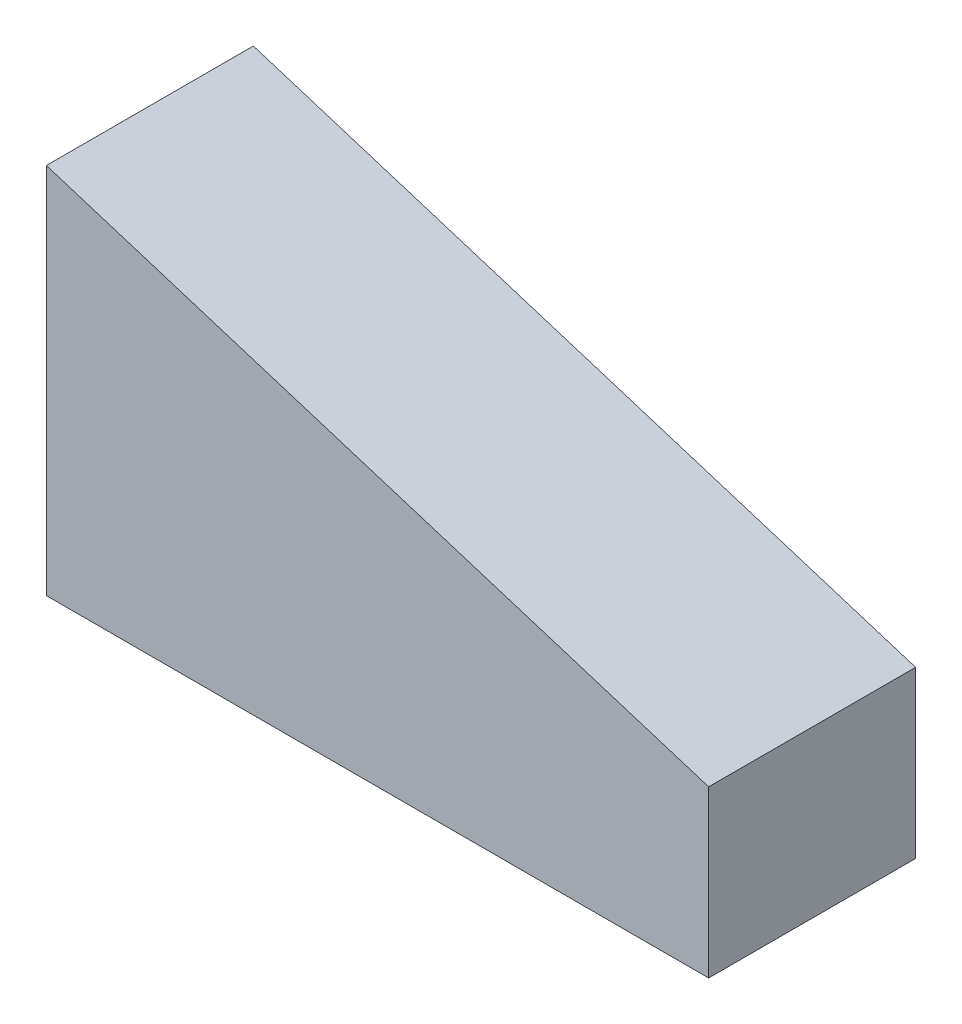
ISO-10303-21;
HEADER;
FILE_DESCRIPTION(('STEP AP214'),'2;1');
FILE_NAME('part.step','',(''),(''),'','','');
FILE_SCHEMA(('AUTOMOTIVE_DESIGN { 1 0 10303 214 1 1 1 1 }'));
ENDSEC;
DATA;
#1=APPLICATION_CONTEXT('core data for automotive mechanical design processes');
#2=APPLICATION_PROTOCOL_DEFINITION('international standard','automotive_design',2000,#1);
#3=PRODUCT_CONTEXT('',#1,'mechanical');
#4=PRODUCT('Part','Part','',(#3));
#5=PRODUCT_RELATED_PRODUCT_CATEGORY('part','',(#4));
#6=PRODUCT_DEFINITION_FORMATION('','',#4);
#7=PRODUCT_DEFINITION_CONTEXT('part definition',#1,'design');
#8=PRODUCT_DEFINITION('design','',#6,#7);
#9=PRODUCT_DEFINITION_SHAPE('','',#8);
#10=(LENGTH_UNIT() NAMED_UNIT(*) SI_UNIT(.MILLI.,.METRE.));
#11=(NAMED_UNIT(*) PLANE_ANGLE_UNIT() SI_UNIT($,.RADIAN.));
#12=(NAMED_UNIT(*) SI_UNIT($,.STERADIAN.) SOLID_ANGLE_UNIT());
#13=UNCERTAINTY_MEASURE_WITH_UNIT(LENGTH_MEASURE(1.E-05),#10,'distance_accuracy_value','');
#14=(GEOMETRIC_REPRESENTATION_CONTEXT(3) GLOBAL_UNCERTAINTY_ASSIGNED_CONTEXT((#13)) GLOBAL_UNIT_ASSIGNED_CONTEXT((#10,
#11,#12)) REPRESENTATION_CONTEXT('',''));
#15=CARTESIAN_POINT('',(0.,0.,0.));
#16=DIRECTION('',(0.,0.,1.));
#17=DIRECTION('',(1.,0.,0.));
#18=AXIS2_PLACEMENT_3D('',#15,#16,#17);
#19=CARTESIAN_POINT('',(0.,0.,25.));
#20=DIRECTION('',(1.,0.,0.));
#21=DIRECTION('',(0.,0.,-1.));
#22=AXIS2_PLACEMENT_3D('',#19,#20,#21);
#23=PLANE('',#22);
#24=DIRECTION('',(0.,-1.,0.));
#25=VECTOR('',#24,1.);
#26=CARTESIAN_POINT('',(0.,0.,0.));
#27=LINE('',#26,#25);
#28=CARTESIAN_POINT('',(0.,45.,0.));
#29=VERTEX_POINT('',#28);
#30=CARTESIAN_POINT('',(0.,0.,0.));
#31=VERTEX_POINT('',#30);
#32=EDGE_CURVE('E95',#29,#31,#27,.T.);
#33=ORIENTED_EDGE('',*,*,#32,.T.);
#34=DIRECTION('',(0.,0.,-1.));
#35=VECTOR('',#34,1.);
#36=CARTESIAN_POINT('',(0.,0.,25.));
#37=LINE('',#36,#35);
#38=CARTESIAN_POINT('',(0.,0.,25.));
#39=VERTEX_POINT('',#38);
#40=EDGE_CURVE('E11',#39,#31,#37,.T.);
#41=ORIENTED_EDGE('',*,*,#40,.F.);
#42=DIRECTION('',(0.,-1.,0.));
#43=VECTOR('',#42,1.);
#44=CARTESIAN_POINT('',(0.,0.,25.));
#45=LINE('',#44,#43);
#46=CARTESIAN_POINT('',(0.,45.,25.));
#47=VERTEX_POINT('',#46);
#48=EDGE_CURVE('E83',#47,#39,#45,.T.);
#49=ORIENTED_EDGE('',*,*,#48,.F.);
#50=DIRECTION('',(0.,0.,-1.));
#51=VECTOR('',#50,1.);
#52=CARTESIAN_POINT('',(0.,45.,25.));
#53=LINE('',#52,#51);
#54=EDGE_CURVE('E91',#47,#29,#53,.T.);
#55=ORIENTED_EDGE('',*,*,#54,.T.);
#56=EDGE_LOOP('',(#33,#41,#49,#55));
#57=FACE_BOUND('',#56,.T.);
#58=ADVANCED_FACE('F32',(#57),#23,.F.);
#59=CARTESIAN_POINT('',(0.,0.,25.));
#60=DIRECTION('',(0.,1.,0.));
#61=DIRECTION('',(0.,0.,1.));
#62=AXIS2_PLACEMENT_3D('',#59,#60,#61);
#63=PLANE('',#62);
#64=DIRECTION('',(1.,0.,0.));
#65=VECTOR('',#64,1.);
#66=CARTESIAN_POINT('',(0.,0.,0.));
#67=LINE('',#66,#65);
#68=CARTESIAN_POINT('',(80.,0.,0.));
#69=VERTEX_POINT('',#68);
#70=EDGE_CURVE('E87',#31,#69,#67,.T.);
#71=ORIENTED_EDGE('',*,*,#70,.T.);
#72=DIRECTION('',(0.,0.,-1.));
#73=VECTOR('',#72,1.);
#74=CARTESIAN_POINT('',(80.,0.,25.));
#75=LINE('',#74,#73);
#76=CARTESIAN_POINT('',(80.,0.,25.));
#77=VERTEX_POINT('',#76);
#78=EDGE_CURVE('E40',#77,#69,#75,.T.);
#79=ORIENTED_EDGE('',*,*,#78,.F.);
#80=DIRECTION('',(1.,0.,0.));
#81=VECTOR('',#80,1.);
#82=CARTESIAN_POINT('',(0.,0.,25.));
#83=LINE('',#82,#81);
#84=EDGE_CURVE('E78',#39,#77,#83,.T.);
#85=ORIENTED_EDGE('',*,*,#84,.F.);
#86=ORIENTED_EDGE('',*,*,#40,.T.);
#87=EDGE_LOOP('',(#71,#79,#85,#86));
#88=FACE_BOUND('',#87,.T.);
#89=ADVANCED_FACE('F86',(#88),#63,.F.);
#90=CARTESIAN_POINT('',(80.,0.,25.));
#91=DIRECTION('',(-1.,0.,0.));
#92=DIRECTION('',(0.,0.,1.));
#93=AXIS2_PLACEMENT_3D('',#90,#91,#92);
#94=PLANE('',#93);
#95=DIRECTION('',(0.,1.,0.));
#96=VECTOR('',#95,1.);
#97=CARTESIAN_POINT('',(80.,0.,0.));
#98=LINE('',#97,#96);
#99=CARTESIAN_POINT('',(80.,20.,0.));
#100=VERTEX_POINT('',#99);
#101=EDGE_CURVE('E65',#69,#100,#98,.T.);
#102=ORIENTED_EDGE('',*,*,#101,.T.);
#103=DIRECTION('',(0.,0.,-1.));
#104=VECTOR('',#103,1.);
#105=CARTESIAN_POINT('',(80.,20.,25.));
#106=LINE('',#105,#104);
#107=CARTESIAN_POINT('',(80.,20.,25.));
#108=VERTEX_POINT('',#107);
#109=EDGE_CURVE('E88',#108,#100,#106,.T.);
#110=ORIENTED_EDGE('',*,*,#109,.F.);
#111=DIRECTION('',(0.,1.,0.));
#112=VECTOR('',#111,1.);
#113=CARTESIAN_POINT('',(80.,0.,25.));
#114=LINE('',#113,#112);
#115=EDGE_CURVE('E81',#77,#108,#114,.T.);
#116=ORIENTED_EDGE('',*,*,#115,.F.);
#117=ORIENTED_EDGE('',*,*,#78,.T.);
#118=EDGE_LOOP('',(#102,#110,#116,#117));
#119=FACE_BOUND('',#118,.T.);
#120=ADVANCED_FACE('F89',(#119),#94,.F.);
#121=CARTESIAN_POINT('',(0.,45.,25.));
#122=DIRECTION('',(-0.298274993135947,-0.95447997803503,0.));
#123=DIRECTION('',(0.95447997803503,-0.298274993135947,0.));
#124=AXIS2_PLACEMENT_3D('',#121,#122,#123);
#125=PLANE('',#124);
#126=DIRECTION('',(-0.95447997803503,0.298274993135947,0.));
#127=VECTOR('',#126,1.);
#128=CARTESIAN_POINT('',(0.,45.,0.));
#129=LINE('',#128,#127);
#130=EDGE_CURVE('E71',#100,#29,#129,.T.);
#131=ORIENTED_EDGE('',*,*,#130,.T.);
#132=ORIENTED_EDGE('',*,*,#54,.F.);
#133=DIRECTION('',(-0.95447997803503,0.298274993135947,0.));
#134=VECTOR('',#133,1.);
#135=CARTESIAN_POINT('',(0.,45.,25.));
#136=LINE('',#135,#134);
#137=EDGE_CURVE('E48',#108,#47,#136,.T.);
#138=ORIENTED_EDGE('',*,*,#137,.F.);
#139=ORIENTED_EDGE('',*,*,#109,.T.);
#140=EDGE_LOOP('',(#131,#132,#138,#139));
#141=FACE_BOUND('',#140,.T.);
#142=ADVANCED_FACE('F102',(#141),#125,.F.);
#143=CARTESIAN_POINT('',(0.,0.,25.));
#144=DIRECTION('',(0.,0.,-1.));
#145=DIRECTION('',(-1.,0.,0.));
#146=AXIS2_PLACEMENT_3D('',#143,#144,#145);
#147=PLANE('',#146);
#148=ORIENTED_EDGE('',*,*,#48,.T.);
#149=ORIENTED_EDGE('',*,*,#84,.T.);
#150=ORIENTED_EDGE('',*,*,#115,.T.);
#151=ORIENTED_EDGE('',*,*,#137,.T.);
#152=EDGE_LOOP('',(#148,#149,#150,#151));
#153=FACE_BOUND('',#152,.T.);
#154=ADVANCED_FACE('F79',(#153),#147,.F.);
#155=CARTESIAN_POINT('',(0.,0.,0.));
#156=DIRECTION('',(0.,0.,-1.));
#157=DIRECTION('',(-1.,0.,0.));
#158=AXIS2_PLACEMENT_3D('',#155,#156,#157);
#159=PLANE('',#158);
#160=ORIENTED_EDGE('',*,*,#32,.F.);
#161=ORIENTED_EDGE('',*,*,#130,.F.);
#162=ORIENTED_EDGE('',*,*,#101,.F.);
#163=ORIENTED_EDGE('',*,*,#70,.F.);
#164=EDGE_LOOP('',(#160,#161,#162,#163));
#165=FACE_BOUND('',#164,.T.);
#166=ADVANCED_FACE('F105',(#165),#159,.T.);
#167=CLOSED_SHELL('',(#58,#89,#120,#142,#154,#166));
#168=MANIFOLD_SOLID_BREP('B2',#167);
#169=ADVANCED_BREP_SHAPE_REPRESENTATION('',(#18,#168),#14);
#170=SHAPE_DEFINITION_REPRESENTATION(#9,#169);
ENDSEC;
END-ISO-10303-21;
